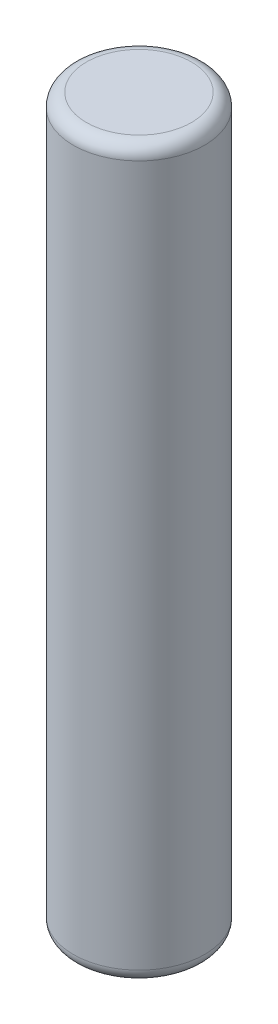
ISO-10303-21;
HEADER;
FILE_DESCRIPTION(('STEP AP214'),'2;1');
FILE_NAME('part.step','',(''),(''),'','','');
FILE_SCHEMA(('AUTOMOTIVE_DESIGN { 1 0 10303 214 1 1 1 1 }'));
ENDSEC;
DATA;
#1=APPLICATION_CONTEXT('core data for automotive mechanical design processes');
#2=APPLICATION_PROTOCOL_DEFINITION('international standard','automotive_design',2000,#1);
#3=PRODUCT_CONTEXT('',#1,'mechanical');
#4=PRODUCT('Part','Part','',(#3));
#5=PRODUCT_RELATED_PRODUCT_CATEGORY('part','',(#4));
#6=PRODUCT_DEFINITION_FORMATION('','',#4);
#7=PRODUCT_DEFINITION_CONTEXT('part definition',#1,'design');
#8=PRODUCT_DEFINITION('design','',#6,#7);
#9=PRODUCT_DEFINITION_SHAPE('','',#8);
#10=(LENGTH_UNIT() NAMED_UNIT(*) SI_UNIT(.MILLI.,.METRE.));
#11=(NAMED_UNIT(*) PLANE_ANGLE_UNIT() SI_UNIT($,.RADIAN.));
#12=(NAMED_UNIT(*) SI_UNIT($,.STERADIAN.) SOLID_ANGLE_UNIT());
#13=UNCERTAINTY_MEASURE_WITH_UNIT(LENGTH_MEASURE(1.E-05),#10,'distance_accuracy_value','');
#14=(GEOMETRIC_REPRESENTATION_CONTEXT(3) GLOBAL_UNCERTAINTY_ASSIGNED_CONTEXT((#13)) GLOBAL_UNIT_ASSIGNED_CONTEXT((#10,
#11,#12)) REPRESENTATION_CONTEXT('',''));
#15=CARTESIAN_POINT('',(0.,0.,0.));
#16=DIRECTION('',(0.,0.,1.));
#17=DIRECTION('',(1.,0.,0.));
#18=AXIS2_PLACEMENT_3D('',#15,#16,#17);
#19=CARTESIAN_POINT('',(0.,27.7,0.));
#20=DIRECTION('',(0.,-1.,0.));
#21=DIRECTION('',(0.,0.,-1.));
#22=AXIS2_PLACEMENT_3D('',#19,#20,#21);
#23=CYLINDRICAL_SURFACE('',#22,2.5);
#24=CARTESIAN_POINT('',(0.,0.5,0.));
#25=DIRECTION('',(0.,1.,0.));
#26=DIRECTION('',(0.,0.,1.));
#27=AXIS2_PLACEMENT_3D('',#24,#25,#26);
#28=CIRCLE('',#27,2.5);
#29=CARTESIAN_POINT('',(0.,0.5,2.5));
#30=VERTEX_POINT('',#29);
#31=EDGE_CURVE('E45',#30,#30,#28,.T.);
#32=ORIENTED_EDGE('',*,*,#31,.T.);
#33=EDGE_LOOP('',(#32));
#34=FACE_BOUND('',#33,.T.);
#35=CARTESIAN_POINT('',(0.,27.2,0.));
#36=DIRECTION('',(0.,1.,0.));
#37=DIRECTION('',(0.,0.,1.));
#38=AXIS2_PLACEMENT_3D('',#35,#36,#37);
#39=CIRCLE('',#38,2.5);
#40=CARTESIAN_POINT('',(0.,27.2,2.5));
#41=VERTEX_POINT('',#40);
#42=EDGE_CURVE('E49',#41,#41,#39,.F.);
#43=ORIENTED_EDGE('',*,*,#42,.T.);
#44=EDGE_LOOP('',(#43));
#45=FACE_BOUND('',#44,.T.);
#46=ADVANCED_FACE('F34',(#34,#45),#23,.T.);
#47=CARTESIAN_POINT('',(0.,27.7,0.));
#48=DIRECTION('',(0.,1.,0.));
#49=DIRECTION('',(0.,0.,1.));
#50=AXIS2_PLACEMENT_3D('',#47,#48,#49);
#51=PLANE('',#50);
#52=CARTESIAN_POINT('',(0.,27.7,0.));
#53=DIRECTION('',(0.,1.,0.));
#54=DIRECTION('',(0.,0.,1.));
#55=AXIS2_PLACEMENT_3D('',#52,#53,#54);
#56=CIRCLE('',#55,2.);
#57=CARTESIAN_POINT('',(0.,27.7,2.));
#58=VERTEX_POINT('',#57);
#59=EDGE_CURVE('E10',#58,#58,#56,.T.);
#60=ORIENTED_EDGE('',*,*,#59,.T.);
#61=EDGE_LOOP('',(#60));
#62=FACE_BOUND('',#61,.T.);
#63=ADVANCED_FACE('F65',(#62),#51,.T.);
#64=CARTESIAN_POINT('',(0.,0.,0.));
#65=DIRECTION('',(0.,1.,0.));
#66=DIRECTION('',(0.,0.,1.));
#67=AXIS2_PLACEMENT_3D('',#64,#65,#66);
#68=PLANE('',#67);
#69=CARTESIAN_POINT('',(0.,0.,0.));
#70=DIRECTION('',(0.,1.,0.));
#71=DIRECTION('',(0.,0.,1.));
#72=AXIS2_PLACEMENT_3D('',#69,#70,#71);
#73=CIRCLE('',#72,2.);
#74=CARTESIAN_POINT('',(0.,0.,2.));
#75=VERTEX_POINT('',#74);
#76=EDGE_CURVE('E41',#75,#75,#73,.F.);
#77=ORIENTED_EDGE('',*,*,#76,.T.);
#78=EDGE_LOOP('',(#77));
#79=FACE_BOUND('',#78,.T.);
#80=ADVANCED_FACE('F62',(#79),#68,.F.);
#81=CARTESIAN_POINT('',(0.,0.5,0.));
#82=DIRECTION('',(0.,1.,0.));
#83=DIRECTION('',(0.,0.,1.));
#84=AXIS2_PLACEMENT_3D('',#81,#82,#83);
#85=TOROIDAL_SURFACE('',#84,2.,0.5);
#86=ORIENTED_EDGE('',*,*,#76,.F.);
#87=EDGE_LOOP('',(#86));
#88=FACE_BOUND('',#87,.T.);
#89=ORIENTED_EDGE('',*,*,#31,.F.);
#90=EDGE_LOOP('',(#89));
#91=FACE_BOUND('',#90,.T.);
#92=ADVANCED_FACE('F58',(#88,#91),#85,.T.);
#93=CARTESIAN_POINT('',(0.,27.2,0.));
#94=DIRECTION('',(0.,1.,0.));
#95=DIRECTION('',(0.,0.,1.));
#96=AXIS2_PLACEMENT_3D('',#93,#94,#95);
#97=TOROIDAL_SURFACE('',#96,2.,0.5);
#98=ORIENTED_EDGE('',*,*,#42,.F.);
#99=EDGE_LOOP('',(#98));
#100=FACE_BOUND('',#99,.T.);
#101=ORIENTED_EDGE('',*,*,#59,.F.);
#102=EDGE_LOOP('',(#101));
#103=FACE_BOUND('',#102,.T.);
#104=ADVANCED_FACE('F36',(#100,#103),#97,.T.);
#105=CLOSED_SHELL('',(#46,#63,#80,#92,#104));
#106=MANIFOLD_SOLID_BREP('B2',#105);
#107=ADVANCED_BREP_SHAPE_REPRESENTATION('',(#18,#106),#14);
#108=SHAPE_DEFINITION_REPRESENTATION(#9,#107);
ENDSEC;
END-ISO-10303-21;
